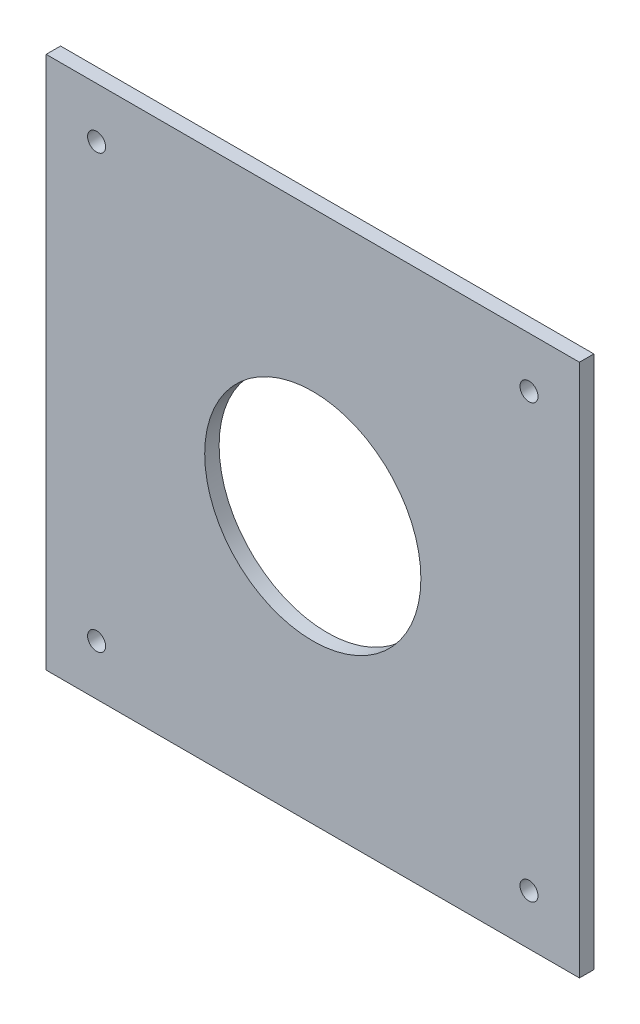
ISO-10303-21;
HEADER;
FILE_DESCRIPTION(('STEP AP214'),'2;1');
FILE_NAME('part.step','',(''),(''),'','','');
FILE_SCHEMA(('AUTOMOTIVE_DESIGN { 1 0 10303 214 1 1 1 1 }'));
ENDSEC;
DATA;
#1=APPLICATION_CONTEXT('core data for automotive mechanical design processes');
#2=APPLICATION_PROTOCOL_DEFINITION('international standard','automotive_design',2000,#1);
#3=PRODUCT_CONTEXT('',#1,'mechanical');
#4=PRODUCT('Part','Part','',(#3));
#5=PRODUCT_RELATED_PRODUCT_CATEGORY('part','',(#4));
#6=PRODUCT_DEFINITION_FORMATION('','',#4);
#7=PRODUCT_DEFINITION_CONTEXT('part definition',#1,'design');
#8=PRODUCT_DEFINITION('design','',#6,#7);
#9=PRODUCT_DEFINITION_SHAPE('','',#8);
#10=(LENGTH_UNIT() NAMED_UNIT(*) SI_UNIT(.MILLI.,.METRE.));
#11=(NAMED_UNIT(*) PLANE_ANGLE_UNIT() SI_UNIT($,.RADIAN.));
#12=(NAMED_UNIT(*) SI_UNIT($,.STERADIAN.) SOLID_ANGLE_UNIT());
#13=UNCERTAINTY_MEASURE_WITH_UNIT(LENGTH_MEASURE(1.E-05),#10,'distance_accuracy_value','');
#14=(GEOMETRIC_REPRESENTATION_CONTEXT(3) GLOBAL_UNCERTAINTY_ASSIGNED_CONTEXT((#13)) GLOBAL_UNIT_ASSIGNED_CONTEXT((#10,
#11,#12)) REPRESENTATION_CONTEXT('',''));
#15=CARTESIAN_POINT('',(0.,0.,0.));
#16=DIRECTION('',(0.,0.,1.));
#17=DIRECTION('',(1.,0.,0.));
#18=AXIS2_PLACEMENT_3D('',#15,#16,#17);
#19=CARTESIAN_POINT('',(0.,0.,0.));
#20=DIRECTION('',(0.,0.,-1.));
#21=DIRECTION('',(-1.,0.,0.));
#22=AXIS2_PLACEMENT_3D('',#19,#20,#21);
#23=PLANE('',#22);
#24=DIRECTION('',(0.,-1.,0.));
#25=VECTOR('',#24,1.);
#26=CARTESIAN_POINT('',(0.,0.,0.));
#27=LINE('',#26,#25);
#28=CARTESIAN_POINT('',(0.,74.,0.));
#29=VERTEX_POINT('',#28);
#30=CARTESIAN_POINT('',(0.,0.,0.));
#31=VERTEX_POINT('',#30);
#32=EDGE_CURVE('E98',#29,#31,#27,.T.);
#33=ORIENTED_EDGE('',*,*,#32,.F.);
#34=DIRECTION('',(-1.,0.,0.));
#35=VECTOR('',#34,1.);
#36=CARTESIAN_POINT('',(0.,74.,0.));
#37=LINE('',#36,#35);
#38=CARTESIAN_POINT('',(74.,74.,0.));
#39=VERTEX_POINT('',#38);
#40=EDGE_CURVE('E74',#39,#29,#37,.T.);
#41=ORIENTED_EDGE('',*,*,#40,.F.);
#42=DIRECTION('',(0.,1.,0.));
#43=VECTOR('',#42,1.);
#44=CARTESIAN_POINT('',(74.,0.,0.));
#45=LINE('',#44,#43);
#46=CARTESIAN_POINT('',(74.,0.,0.));
#47=VERTEX_POINT('',#46);
#48=EDGE_CURVE('E68',#47,#39,#45,.T.);
#49=ORIENTED_EDGE('',*,*,#48,.F.);
#50=DIRECTION('',(1.,0.,0.));
#51=VECTOR('',#50,1.);
#52=CARTESIAN_POINT('',(0.,0.,0.));
#53=LINE('',#52,#51);
#54=EDGE_CURVE('E90',#31,#47,#53,.T.);
#55=ORIENTED_EDGE('',*,*,#54,.F.);
#56=EDGE_LOOP('',(#33,#41,#49,#55));
#57=FACE_BOUND('',#56,.T.);
#58=CARTESIAN_POINT('',(37.,37.,0.));
#59=DIRECTION('',(0.,0.,1.));
#60=DIRECTION('',(1.,0.,0.));
#61=AXIS2_PLACEMENT_3D('',#58,#59,#60);
#62=CIRCLE('',#61,15.);
#63=CARTESIAN_POINT('',(52.,37.,0.));
#64=VERTEX_POINT('',#63);
#65=EDGE_CURVE('E101',#64,#64,#62,.T.);
#66=ORIENTED_EDGE('',*,*,#65,.T.);
#67=EDGE_LOOP('',(#66));
#68=FACE_BOUND('',#67,.T.);
#69=CARTESIAN_POINT('',(67.,67.,0.));
#70=DIRECTION('',(0.,0.,1.));
#71=DIRECTION('',(1.,0.,0.));
#72=AXIS2_PLACEMENT_3D('',#69,#70,#71);
#73=CIRCLE('',#72,1.24999999999999);
#74=CARTESIAN_POINT('',(68.25,67.,0.));
#75=VERTEX_POINT('',#74);
#76=EDGE_CURVE('E115',#75,#75,#73,.T.);
#77=ORIENTED_EDGE('',*,*,#76,.T.);
#78=EDGE_LOOP('',(#77));
#79=FACE_BOUND('',#78,.T.);
#80=CARTESIAN_POINT('',(7.00000000000001,67.,0.));
#81=DIRECTION('',(0.,0.,1.));
#82=DIRECTION('',(1.,0.,0.));
#83=AXIS2_PLACEMENT_3D('',#80,#81,#82);
#84=CIRCLE('',#83,1.24999999999999);
#85=CARTESIAN_POINT('',(8.24999999999999,67.,0.));
#86=VERTEX_POINT('',#85);
#87=EDGE_CURVE('E123',#86,#86,#84,.T.);
#88=ORIENTED_EDGE('',*,*,#87,.T.);
#89=EDGE_LOOP('',(#88));
#90=FACE_BOUND('',#89,.T.);
#91=CARTESIAN_POINT('',(67.,7.00000000000001,0.));
#92=DIRECTION('',(0.,0.,1.));
#93=DIRECTION('',(1.,0.,0.));
#94=AXIS2_PLACEMENT_3D('',#91,#92,#93);
#95=CIRCLE('',#94,1.24999999999999);
#96=CARTESIAN_POINT('',(68.25,7.00000000000001,0.));
#97=VERTEX_POINT('',#96);
#98=EDGE_CURVE('E129',#97,#97,#95,.T.);
#99=ORIENTED_EDGE('',*,*,#98,.T.);
#100=EDGE_LOOP('',(#99));
#101=FACE_BOUND('',#100,.T.);
#102=CARTESIAN_POINT('',(7.00000000000001,7.00000000000001,0.));
#103=DIRECTION('',(0.,0.,1.));
#104=DIRECTION('',(1.,0.,0.));
#105=AXIS2_PLACEMENT_3D('',#102,#103,#104);
#106=CIRCLE('',#105,1.24999999999999);
#107=CARTESIAN_POINT('',(8.24999999999999,7.00000000000001,0.));
#108=VERTEX_POINT('',#107);
#109=EDGE_CURVE('E135',#108,#108,#106,.T.);
#110=ORIENTED_EDGE('',*,*,#109,.T.);
#111=EDGE_LOOP('',(#110));
#112=FACE_BOUND('',#111,.T.);
#113=ADVANCED_FACE('F34',(#57,#68,#79,#90,#101,#112),#23,.T.);
#114=CARTESIAN_POINT('',(0.,0.,2.));
#115=DIRECTION('',(1.,0.,0.));
#116=DIRECTION('',(0.,0.,-1.));
#117=AXIS2_PLACEMENT_3D('',#114,#115,#116);
#118=PLANE('',#117);
#119=ORIENTED_EDGE('',*,*,#32,.T.);
#120=DIRECTION('',(0.,0.,-1.));
#121=VECTOR('',#120,1.);
#122=CARTESIAN_POINT('',(0.,0.,2.));
#123=LINE('',#122,#121);
#124=CARTESIAN_POINT('',(0.,0.,2.));
#125=VERTEX_POINT('',#124);
#126=EDGE_CURVE('E11',#125,#31,#123,.T.);
#127=ORIENTED_EDGE('',*,*,#126,.F.);
#128=DIRECTION('',(0.,-1.,0.));
#129=VECTOR('',#128,1.);
#130=CARTESIAN_POINT('',(0.,0.,2.));
#131=LINE('',#130,#129);
#132=CARTESIAN_POINT('',(0.,74.,2.));
#133=VERTEX_POINT('',#132);
#134=EDGE_CURVE('E86',#133,#125,#131,.T.);
#135=ORIENTED_EDGE('',*,*,#134,.F.);
#136=DIRECTION('',(0.,0.,-1.));
#137=VECTOR('',#136,1.);
#138=CARTESIAN_POINT('',(0.,74.,2.));
#139=LINE('',#138,#137);
#140=EDGE_CURVE('E94',#133,#29,#139,.T.);
#141=ORIENTED_EDGE('',*,*,#140,.T.);
#142=EDGE_LOOP('',(#119,#127,#135,#141));
#143=FACE_BOUND('',#142,.T.);
#144=ADVANCED_FACE('F36',(#143),#118,.F.);
#145=CARTESIAN_POINT('',(0.,0.,2.));
#146=DIRECTION('',(0.,1.,0.));
#147=DIRECTION('',(0.,0.,1.));
#148=AXIS2_PLACEMENT_3D('',#145,#146,#147);
#149=PLANE('',#148);
#150=ORIENTED_EDGE('',*,*,#54,.T.);
#151=DIRECTION('',(0.,0.,-1.));
#152=VECTOR('',#151,1.);
#153=CARTESIAN_POINT('',(74.,0.,2.));
#154=LINE('',#153,#152);
#155=CARTESIAN_POINT('',(74.,0.,2.));
#156=VERTEX_POINT('',#155);
#157=EDGE_CURVE('E43',#156,#47,#154,.T.);
#158=ORIENTED_EDGE('',*,*,#157,.F.);
#159=DIRECTION('',(1.,0.,0.));
#160=VECTOR('',#159,1.);
#161=CARTESIAN_POINT('',(0.,0.,2.));
#162=LINE('',#161,#160);
#163=EDGE_CURVE('E81',#125,#156,#162,.T.);
#164=ORIENTED_EDGE('',*,*,#163,.F.);
#165=ORIENTED_EDGE('',*,*,#126,.T.);
#166=EDGE_LOOP('',(#150,#158,#164,#165));
#167=FACE_BOUND('',#166,.T.);
#168=ADVANCED_FACE('F89',(#167),#149,.F.);
#169=CARTESIAN_POINT('',(74.,0.,2.));
#170=DIRECTION('',(-1.,0.,0.));
#171=DIRECTION('',(0.,0.,1.));
#172=AXIS2_PLACEMENT_3D('',#169,#170,#171);
#173=PLANE('',#172);
#174=ORIENTED_EDGE('',*,*,#48,.T.);
#175=DIRECTION('',(0.,0.,-1.));
#176=VECTOR('',#175,1.);
#177=CARTESIAN_POINT('',(74.,74.,2.));
#178=LINE('',#177,#176);
#179=CARTESIAN_POINT('',(74.,74.,2.));
#180=VERTEX_POINT('',#179);
#181=EDGE_CURVE('E91',#180,#39,#178,.T.);
#182=ORIENTED_EDGE('',*,*,#181,.F.);
#183=DIRECTION('',(0.,1.,0.));
#184=VECTOR('',#183,1.);
#185=CARTESIAN_POINT('',(74.,0.,2.));
#186=LINE('',#185,#184);
#187=EDGE_CURVE('E84',#156,#180,#186,.T.);
#188=ORIENTED_EDGE('',*,*,#187,.F.);
#189=ORIENTED_EDGE('',*,*,#157,.T.);
#190=EDGE_LOOP('',(#174,#182,#188,#189));
#191=FACE_BOUND('',#190,.T.);
#192=ADVANCED_FACE('F92',(#191),#173,.F.);
#193=CARTESIAN_POINT('',(0.,74.,2.));
#194=DIRECTION('',(0.,-1.,0.));
#195=DIRECTION('',(0.,0.,-1.));
#196=AXIS2_PLACEMENT_3D('',#193,#194,#195);
#197=PLANE('',#196);
#198=ORIENTED_EDGE('',*,*,#40,.T.);
#199=ORIENTED_EDGE('',*,*,#140,.F.);
#200=DIRECTION('',(-1.,0.,0.));
#201=VECTOR('',#200,1.);
#202=CARTESIAN_POINT('',(0.,74.,2.));
#203=LINE('',#202,#201);
#204=EDGE_CURVE('E51',#180,#133,#203,.T.);
#205=ORIENTED_EDGE('',*,*,#204,.F.);
#206=ORIENTED_EDGE('',*,*,#181,.T.);
#207=EDGE_LOOP('',(#198,#199,#205,#206));
#208=FACE_BOUND('',#207,.T.);
#209=ADVANCED_FACE('F106',(#208),#197,.F.);
#210=CARTESIAN_POINT('',(0.,0.,2.));
#211=DIRECTION('',(0.,0.,-1.));
#212=DIRECTION('',(-1.,0.,0.));
#213=AXIS2_PLACEMENT_3D('',#210,#211,#212);
#214=PLANE('',#213);
#215=CARTESIAN_POINT('',(7.00000000000001,7.00000000000001,2.));
#216=DIRECTION('',(0.,0.,1.));
#217=DIRECTION('',(1.,0.,0.));
#218=AXIS2_PLACEMENT_3D('',#215,#216,#217);
#219=CIRCLE('',#218,1.24999999999999);
#220=CARTESIAN_POINT('',(8.24999999999999,7.00000000000001,2.));
#221=VERTEX_POINT('',#220);
#222=EDGE_CURVE('E138',#221,#221,#219,.T.);
#223=ORIENTED_EDGE('',*,*,#222,.F.);
#224=EDGE_LOOP('',(#223));
#225=FACE_BOUND('',#224,.T.);
#226=CARTESIAN_POINT('',(67.,7.00000000000001,2.));
#227=DIRECTION('',(0.,0.,1.));
#228=DIRECTION('',(1.,0.,0.));
#229=AXIS2_PLACEMENT_3D('',#226,#227,#228);
#230=CIRCLE('',#229,1.24999999999999);
#231=CARTESIAN_POINT('',(68.25,7.00000000000001,2.));
#232=VERTEX_POINT('',#231);
#233=EDGE_CURVE('E132',#232,#232,#230,.T.);
#234=ORIENTED_EDGE('',*,*,#233,.F.);
#235=EDGE_LOOP('',(#234));
#236=FACE_BOUND('',#235,.T.);
#237=CARTESIAN_POINT('',(7.00000000000001,67.,2.));
#238=DIRECTION('',(0.,0.,1.));
#239=DIRECTION('',(1.,0.,0.));
#240=AXIS2_PLACEMENT_3D('',#237,#238,#239);
#241=CIRCLE('',#240,1.24999999999999);
#242=CARTESIAN_POINT('',(8.24999999999999,67.,2.));
#243=VERTEX_POINT('',#242);
#244=EDGE_CURVE('E126',#243,#243,#241,.T.);
#245=ORIENTED_EDGE('',*,*,#244,.F.);
#246=EDGE_LOOP('',(#245));
#247=FACE_BOUND('',#246,.T.);
#248=CARTESIAN_POINT('',(67.,67.,2.));
#249=DIRECTION('',(0.,0.,1.));
#250=DIRECTION('',(1.,0.,0.));
#251=AXIS2_PLACEMENT_3D('',#248,#249,#250);
#252=CIRCLE('',#251,1.24999999999999);
#253=CARTESIAN_POINT('',(68.25,67.,2.));
#254=VERTEX_POINT('',#253);
#255=EDGE_CURVE('E120',#254,#254,#252,.T.);
#256=ORIENTED_EDGE('',*,*,#255,.F.);
#257=EDGE_LOOP('',(#256));
#258=FACE_BOUND('',#257,.T.);
#259=CARTESIAN_POINT('',(37.,37.,2.));
#260=DIRECTION('',(0.,0.,1.));
#261=DIRECTION('',(1.,0.,0.));
#262=AXIS2_PLACEMENT_3D('',#259,#260,#261);
#263=CIRCLE('',#262,15.);
#264=CARTESIAN_POINT('',(52.,37.,2.));
#265=VERTEX_POINT('',#264);
#266=EDGE_CURVE('E112',#265,#265,#263,.T.);
#267=ORIENTED_EDGE('',*,*,#266,.F.);
#268=EDGE_LOOP('',(#267));
#269=FACE_BOUND('',#268,.T.);
#270=ORIENTED_EDGE('',*,*,#134,.T.);
#271=ORIENTED_EDGE('',*,*,#163,.T.);
#272=ORIENTED_EDGE('',*,*,#187,.T.);
#273=ORIENTED_EDGE('',*,*,#204,.T.);
#274=EDGE_LOOP('',(#270,#271,#272,#273));
#275=FACE_BOUND('',#274,.T.);
#276=ADVANCED_FACE('F82',(#225,#236,#247,#258,#269,#275),#214,.F.);
#277=CARTESIAN_POINT('',(37.,37.,0.));
#278=DIRECTION('',(0.,0.,1.));
#279=DIRECTION('',(1.,0.,0.));
#280=AXIS2_PLACEMENT_3D('',#277,#278,#279);
#281=CYLINDRICAL_SURFACE('',#280,15.);
#282=ORIENTED_EDGE('',*,*,#65,.F.);
#283=EDGE_LOOP('',(#282));
#284=FACE_BOUND('',#283,.T.);
#285=ORIENTED_EDGE('',*,*,#266,.T.);
#286=EDGE_LOOP('',(#285));
#287=FACE_BOUND('',#286,.T.);
#288=ADVANCED_FACE('F146',(#284,#287),#281,.F.);
#289=CARTESIAN_POINT('',(67.,67.,2.));
#290=DIRECTION('',(0.,0.,1.));
#291=DIRECTION('',(1.,0.,0.));
#292=AXIS2_PLACEMENT_3D('',#289,#290,#291);
#293=CYLINDRICAL_SURFACE('',#292,1.24999999999999);
#294=ORIENTED_EDGE('',*,*,#76,.F.);
#295=EDGE_LOOP('',(#294));
#296=FACE_BOUND('',#295,.T.);
#297=ORIENTED_EDGE('',*,*,#255,.T.);
#298=EDGE_LOOP('',(#297));
#299=FACE_BOUND('',#298,.T.);
#300=ADVANCED_FACE('F157',(#296,#299),#293,.F.);
#301=CARTESIAN_POINT('',(7.00000000000001,67.,2.));
#302=DIRECTION('',(0.,0.,1.));
#303=DIRECTION('',(1.,0.,0.));
#304=AXIS2_PLACEMENT_3D('',#301,#302,#303);
#305=CYLINDRICAL_SURFACE('',#304,1.24999999999999);
#306=ORIENTED_EDGE('',*,*,#87,.F.);
#307=EDGE_LOOP('',(#306));
#308=FACE_BOUND('',#307,.T.);
#309=ORIENTED_EDGE('',*,*,#244,.T.);
#310=EDGE_LOOP('',(#309));
#311=FACE_BOUND('',#310,.T.);
#312=ADVANCED_FACE('F163',(#308,#311),#305,.F.);
#313=CARTESIAN_POINT('',(67.,7.00000000000001,2.));
#314=DIRECTION('',(0.,0.,1.));
#315=DIRECTION('',(1.,0.,0.));
#316=AXIS2_PLACEMENT_3D('',#313,#314,#315);
#317=CYLINDRICAL_SURFACE('',#316,1.24999999999999);
#318=ORIENTED_EDGE('',*,*,#98,.F.);
#319=EDGE_LOOP('',(#318));
#320=FACE_BOUND('',#319,.T.);
#321=ORIENTED_EDGE('',*,*,#233,.T.);
#322=EDGE_LOOP('',(#321));
#323=FACE_BOUND('',#322,.T.);
#324=ADVANCED_FACE('F202',(#320,#323),#317,.F.);
#325=CARTESIAN_POINT('',(7.00000000000001,7.00000000000001,2.));
#326=DIRECTION('',(0.,0.,1.));
#327=DIRECTION('',(1.,0.,0.));
#328=AXIS2_PLACEMENT_3D('',#325,#326,#327);
#329=CYLINDRICAL_SURFACE('',#328,1.24999999999999);
#330=ORIENTED_EDGE('',*,*,#109,.F.);
#331=EDGE_LOOP('',(#330));
#332=FACE_BOUND('',#331,.T.);
#333=ORIENTED_EDGE('',*,*,#222,.T.);
#334=EDGE_LOOP('',(#333));
#335=FACE_BOUND('',#334,.T.);
#336=ADVANCED_FACE('F142',(#332,#335),#329,.F.);
#337=CLOSED_SHELL('',(#113,#144,#168,#192,#209,#276,#288,#300,#312,#324,#336));
#338=MANIFOLD_SOLID_BREP('B2',#337);
#339=ADVANCED_BREP_SHAPE_REPRESENTATION('',(#18,#338),#14);
#340=SHAPE_DEFINITION_REPRESENTATION(#9,#339);
ENDSEC;
END-ISO-10303-21;
